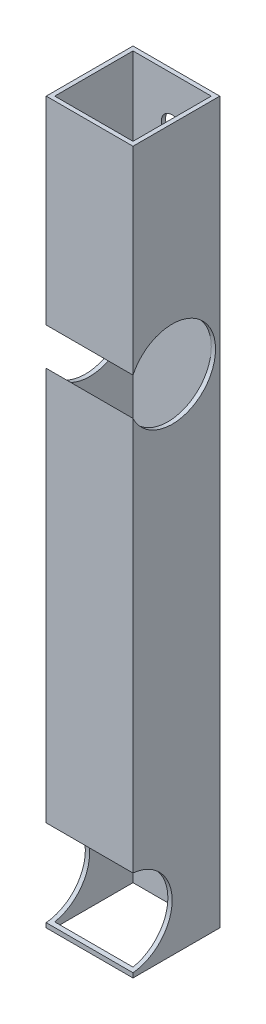
ISO-10303-21;
HEADER;
FILE_DESCRIPTION(('STEP AP214'),'2;1');
FILE_NAME('part.step','',(''),(''),'','','');
FILE_SCHEMA(('AUTOMOTIVE_DESIGN { 1 0 10303 214 1 1 1 1 }'));
ENDSEC;
DATA;
#1=APPLICATION_CONTEXT('core data for automotive mechanical design processes');
#2=APPLICATION_PROTOCOL_DEFINITION('international standard','automotive_design',2000,#1);
#3=PRODUCT_CONTEXT('',#1,'mechanical');
#4=PRODUCT('Part','Part','',(#3));
#5=PRODUCT_RELATED_PRODUCT_CATEGORY('part','',(#4));
#6=PRODUCT_DEFINITION_FORMATION('','',#4);
#7=PRODUCT_DEFINITION_CONTEXT('part definition',#1,'design');
#8=PRODUCT_DEFINITION('design','',#6,#7);
#9=PRODUCT_DEFINITION_SHAPE('','',#8);
#10=(LENGTH_UNIT() NAMED_UNIT(*) SI_UNIT(.MILLI.,.METRE.));
#11=(NAMED_UNIT(*) PLANE_ANGLE_UNIT() SI_UNIT($,.RADIAN.));
#12=(NAMED_UNIT(*) SI_UNIT($,.STERADIAN.) SOLID_ANGLE_UNIT());
#13=UNCERTAINTY_MEASURE_WITH_UNIT(LENGTH_MEASURE(1.E-05),#10,'distance_accuracy_value','');
#14=(GEOMETRIC_REPRESENTATION_CONTEXT(3) GLOBAL_UNCERTAINTY_ASSIGNED_CONTEXT((#13)) GLOBAL_UNIT_ASSIGNED_CONTEXT((#10,
#11,#12)) REPRESENTATION_CONTEXT('',''));
#15=CARTESIAN_POINT('',(0.,0.,0.));
#16=DIRECTION('',(0.,0.,1.));
#17=DIRECTION('',(1.,0.,0.));
#18=AXIS2_PLACEMENT_3D('',#15,#16,#17);
#19=CARTESIAN_POINT('',(-12.7,210.82,12.7));
#20=DIRECTION('',(0.,0.,-1.));
#21=DIRECTION('',(-1.,0.,0.));
#22=AXIS2_PLACEMENT_3D('',#19,#20,#21);
#23=PLANE('',#22);
#24=DIRECTION('',(0.,-1.,0.));
#25=VECTOR('',#24,1.);
#26=CARTESIAN_POINT('',(-12.7,210.82,12.7));
#27=LINE('',#26,#25);
#28=CARTESIAN_POINT('',(-12.7,141.836952413119,12.7));
#29=VERTEX_POINT('',#28);
#30=CARTESIAN_POINT('',(-12.7,26.6088674666681,12.7));
#31=VERTEX_POINT('',#30);
#32=EDGE_CURVE('E189',#29,#31,#27,.T.);
#33=ORIENTED_EDGE('',*,*,#32,.T.);
#34=DIRECTION('',(1.,0.,0.));
#35=VECTOR('',#34,1.);
#36=CARTESIAN_POINT('',(-198.12,26.6088674666681,12.7));
#37=LINE('',#36,#35);
#38=CARTESIAN_POINT('',(12.7,26.6088674666681,12.7));
#39=VERTEX_POINT('',#38);
#40=EDGE_CURVE('E247',#31,#39,#37,.T.);
#41=ORIENTED_EDGE('',*,*,#40,.T.);
#42=DIRECTION('',(0.,-1.,0.));
#43=VECTOR('',#42,1.);
#44=CARTESIAN_POINT('',(12.7,210.82,12.7));
#45=LINE('',#44,#43);
#46=CARTESIAN_POINT('',(12.7,141.836952413119,12.7));
#47=VERTEX_POINT('',#46);
#48=EDGE_CURVE('E186',#47,#39,#45,.T.);
#49=ORIENTED_EDGE('',*,*,#48,.F.);
#50=DIRECTION('',(1.,0.,0.));
#51=VECTOR('',#50,1.);
#52=CARTESIAN_POINT('',(-198.12,141.836952413119,12.7));
#53=LINE('',#52,#51);
#54=EDGE_CURVE('E163',#47,#29,#53,.F.);
#55=ORIENTED_EDGE('',*,*,#54,.T.);
#56=EDGE_LOOP('',(#33,#41,#49,#55));
#57=FACE_BOUND('',#56,.T.);
#58=ADVANCED_FACE('F43',(#57),#23,.F.);
#59=CARTESIAN_POINT('',(-12.7,210.82,12.7));
#60=VERTEX_POINT('',#59);
#61=CARTESIAN_POINT('',(-12.7,152.803047586881,12.7));
#62=VERTEX_POINT('',#61);
#63=EDGE_CURVE('E179',#60,#62,#27,.T.);
#64=ORIENTED_EDGE('',*,*,#63,.T.);
#65=DIRECTION('',(1.,0.,0.));
#66=VECTOR('',#65,1.);
#67=CARTESIAN_POINT('',(-198.12,152.803047586881,12.7));
#68=LINE('',#67,#66);
#69=CARTESIAN_POINT('',(12.7,152.803047586881,12.7));
#70=VERTEX_POINT('',#69);
#71=EDGE_CURVE('E162',#62,#70,#68,.T.);
#72=ORIENTED_EDGE('',*,*,#71,.T.);
#73=CARTESIAN_POINT('',(12.7,210.82,12.7));
#74=VERTEX_POINT('',#73);
#75=EDGE_CURVE('E176',#74,#70,#45,.T.);
#76=ORIENTED_EDGE('',*,*,#75,.F.);
#77=DIRECTION('',(1.,0.,0.));
#78=VECTOR('',#77,1.);
#79=CARTESIAN_POINT('',(-12.7,210.82,12.7));
#80=LINE('',#79,#78);
#81=EDGE_CURVE('E192',#60,#74,#80,.T.);
#82=ORIENTED_EDGE('',*,*,#81,.F.);
#83=EDGE_LOOP('',(#64,#72,#76,#82));
#84=FACE_BOUND('',#83,.T.);
#85=ADVANCED_FACE('F174',(#84),#23,.F.);
#86=CARTESIAN_POINT('',(11.4554,210.82,11.4554));
#87=DIRECTION('',(-1.,0.,0.));
#88=DIRECTION('',(0.,0.,1.));
#89=AXIS2_PLACEMENT_3D('',#86,#87,#88);
#90=PLANE('',#89);
#91=CARTESIAN_POINT('',(11.4554,147.32,1.2446));
#92=DIRECTION('',(-1.,0.,0.));
#93=DIRECTION('',(0.,0.,1.));
#94=AXIS2_PLACEMENT_3D('',#91,#92,#93);
#95=CIRCLE('',#94,12.7);
#96=CARTESIAN_POINT('',(11.4554,154.871792062815,11.4554));
#97=VERTEX_POINT('',#96);
#98=CARTESIAN_POINT('',(11.4554,147.32,-11.4554));
#99=VERTEX_POINT('',#98);
#100=EDGE_CURVE('E266',#97,#99,#95,.T.);
#101=ORIENTED_EDGE('',*,*,#100,.F.);
#102=DIRECTION('',(0.,-1.,0.));
#103=VECTOR('',#102,1.);
#104=CARTESIAN_POINT('',(11.4554,210.82,11.4554));
#105=LINE('',#104,#103);
#106=CARTESIAN_POINT('',(11.4554,210.82,11.4554));
#107=VERTEX_POINT('',#106);
#108=EDGE_CURVE('E229',#107,#97,#105,.T.);
#109=ORIENTED_EDGE('',*,*,#108,.F.);
#110=DIRECTION('',(0.,0.,-1.));
#111=VECTOR('',#110,1.);
#112=CARTESIAN_POINT('',(11.4554,210.82,11.4554));
#113=LINE('',#112,#111);
#114=CARTESIAN_POINT('',(11.4554,210.82,-11.4554));
#115=VERTEX_POINT('',#114);
#116=EDGE_CURVE('E237',#107,#115,#113,.T.);
#117=ORIENTED_EDGE('',*,*,#116,.T.);
#118=DIRECTION('',(0.,-1.,0.));
#119=VECTOR('',#118,1.);
#120=CARTESIAN_POINT('',(11.4554,210.82,-11.4554));
#121=LINE('',#120,#119);
#122=EDGE_CURVE('E207',#115,#99,#121,.T.);
#123=ORIENTED_EDGE('',*,*,#122,.T.);
#124=EDGE_LOOP('',(#101,#109,#117,#123));
#125=FACE_BOUND('',#124,.T.);
#126=ADVANCED_FACE('F352',(#125),#90,.T.);
#127=CARTESIAN_POINT('',(-11.4554,210.82,11.4554));
#128=DIRECTION('',(1.,0.,0.));
#129=DIRECTION('',(0.,0.,-1.));
#130=AXIS2_PLACEMENT_3D('',#127,#128,#129);
#131=PLANE('',#130);
#132=CARTESIAN_POINT('',(-11.4554,147.32,1.2446));
#133=DIRECTION('',(1.,0.,0.));
#134=DIRECTION('',(0.,0.,-1.));
#135=AXIS2_PLACEMENT_3D('',#132,#133,#134);
#136=CIRCLE('',#135,12.7);
#137=CARTESIAN_POINT('',(-11.4554,147.32,-11.4554));
#138=VERTEX_POINT('',#137);
#139=CARTESIAN_POINT('',(-11.4554,154.871792062815,11.4554));
#140=VERTEX_POINT('',#139);
#141=EDGE_CURVE('E269',#138,#140,#136,.T.);
#142=ORIENTED_EDGE('',*,*,#141,.F.);
#143=DIRECTION('',(0.,-1.,0.));
#144=VECTOR('',#143,1.);
#145=CARTESIAN_POINT('',(-11.4554,210.82,-11.4554));
#146=LINE('',#145,#144);
#147=CARTESIAN_POINT('',(-11.4554,210.82,-11.4554));
#148=VERTEX_POINT('',#147);
#149=EDGE_CURVE('E220',#148,#138,#146,.T.);
#150=ORIENTED_EDGE('',*,*,#149,.F.);
#151=DIRECTION('',(0.,0.,1.));
#152=VECTOR('',#151,1.);
#153=CARTESIAN_POINT('',(-11.4554,210.82,11.4554));
#154=LINE('',#153,#152);
#155=CARTESIAN_POINT('',(-11.4554,210.82,11.4554));
#156=VERTEX_POINT('',#155);
#157=EDGE_CURVE('E250',#148,#156,#154,.T.);
#158=ORIENTED_EDGE('',*,*,#157,.T.);
#159=DIRECTION('',(0.,-1.,0.));
#160=VECTOR('',#159,1.);
#161=CARTESIAN_POINT('',(-11.4554,210.82,11.4554));
#162=LINE('',#161,#160);
#163=EDGE_CURVE('E224',#156,#140,#162,.T.);
#164=ORIENTED_EDGE('',*,*,#163,.T.);
#165=EDGE_LOOP('',(#142,#150,#158,#164));
#166=FACE_BOUND('',#165,.T.);
#167=ADVANCED_FACE('F341',(#166),#131,.T.);
#168=CARTESIAN_POINT('',(-11.4554,210.82,11.4554));
#169=DIRECTION('',(0.,0.,-1.));
#170=DIRECTION('',(-1.,0.,0.));
#171=AXIS2_PLACEMENT_3D('',#168,#169,#170);
#172=PLANE('',#171);
#173=DIRECTION('',(1.,0.,0.));
#174=VECTOR('',#173,1.);
#175=CARTESIAN_POINT('',(-198.12,26.4236694736933,11.4554));
#176=LINE('',#175,#174);
#177=CARTESIAN_POINT('',(-11.4554,26.4236694736933,11.4554));
#178=VERTEX_POINT('',#177);
#179=CARTESIAN_POINT('',(11.4554,26.4236694736933,11.4554));
#180=VERTEX_POINT('',#179);
#181=EDGE_CURVE('E11',#178,#180,#176,.T.);
#182=ORIENTED_EDGE('',*,*,#181,.F.);
#183=CARTESIAN_POINT('',(-11.4554,139.768207937185,11.4554));
#184=VERTEX_POINT('',#183);
#185=EDGE_CURVE('E227',#184,#178,#162,.T.);
#186=ORIENTED_EDGE('',*,*,#185,.F.);
#187=DIRECTION('',(1.,0.,0.));
#188=VECTOR('',#187,1.);
#189=CARTESIAN_POINT('',(-198.12,139.768207937185,11.4554));
#190=LINE('',#189,#188);
#191=CARTESIAN_POINT('',(11.4554,139.768207937185,11.4554));
#192=VERTEX_POINT('',#191);
#193=EDGE_CURVE('E307',#192,#184,#190,.F.);
#194=ORIENTED_EDGE('',*,*,#193,.F.);
#195=EDGE_CURVE('E232',#192,#180,#105,.T.);
#196=ORIENTED_EDGE('',*,*,#195,.T.);
#197=EDGE_LOOP('',(#182,#186,#194,#196));
#198=FACE_BOUND('',#197,.T.);
#199=ADVANCED_FACE('F361',(#198),#172,.T.);
#200=DIRECTION('',(1.,0.,0.));
#201=VECTOR('',#200,1.);
#202=CARTESIAN_POINT('',(-198.12,154.871792062815,11.4554));
#203=LINE('',#202,#201);
#204=EDGE_CURVE('E309',#140,#97,#203,.T.);
#205=ORIENTED_EDGE('',*,*,#204,.F.);
#206=ORIENTED_EDGE('',*,*,#163,.F.);
#207=DIRECTION('',(1.,0.,0.));
#208=VECTOR('',#207,1.);
#209=CARTESIAN_POINT('',(-11.4554,210.82,11.4554));
#210=LINE('',#209,#208);
#211=EDGE_CURVE('E248',#156,#107,#210,.T.);
#212=ORIENTED_EDGE('',*,*,#211,.T.);
#213=ORIENTED_EDGE('',*,*,#108,.T.);
#214=EDGE_LOOP('',(#205,#206,#212,#213));
#215=FACE_BOUND('',#214,.T.);
#216=ADVANCED_FACE('F349',(#215),#172,.T.);
#217=CARTESIAN_POINT('',(0.,210.82,0.));
#218=DIRECTION('',(0.,-1.,0.));
#219=DIRECTION('',(0.,0.,-1.));
#220=AXIS2_PLACEMENT_3D('',#217,#218,#219);
#221=PLANE('',#220);
#222=DIRECTION('',(0.,0.,-1.));
#223=VECTOR('',#222,1.);
#224=CARTESIAN_POINT('',(12.7,210.82,12.7));
#225=LINE('',#224,#223);
#226=CARTESIAN_POINT('',(12.7,210.82,-12.7));
#227=VERTEX_POINT('',#226);
#228=EDGE_CURVE('E184',#74,#227,#225,.T.);
#229=ORIENTED_EDGE('',*,*,#228,.T.);
#230=DIRECTION('',(-1.,0.,0.));
#231=VECTOR('',#230,1.);
#232=CARTESIAN_POINT('',(-12.7,210.82,-12.7));
#233=LINE('',#232,#231);
#234=CARTESIAN_POINT('',(-12.7,210.82,-12.7));
#235=VERTEX_POINT('',#234);
#236=EDGE_CURVE('E200',#227,#235,#233,.T.);
#237=ORIENTED_EDGE('',*,*,#236,.T.);
#238=DIRECTION('',(0.,0.,1.));
#239=VECTOR('',#238,1.);
#240=CARTESIAN_POINT('',(-12.7,210.82,12.7));
#241=LINE('',#240,#239);
#242=EDGE_CURVE('E197',#235,#60,#241,.T.);
#243=ORIENTED_EDGE('',*,*,#242,.T.);
#244=ORIENTED_EDGE('',*,*,#81,.T.);
#245=EDGE_LOOP('',(#229,#237,#243,#244));
#246=FACE_BOUND('',#245,.T.);
#247=ORIENTED_EDGE('',*,*,#116,.F.);
#248=ORIENTED_EDGE('',*,*,#211,.F.);
#249=ORIENTED_EDGE('',*,*,#157,.F.);
#250=DIRECTION('',(-1.,0.,0.));
#251=VECTOR('',#250,1.);
#252=CARTESIAN_POINT('',(-11.4554,210.82,-11.4554));
#253=LINE('',#252,#251);
#254=EDGE_CURVE('E253',#115,#148,#253,.T.);
#255=ORIENTED_EDGE('',*,*,#254,.F.);
#256=EDGE_LOOP('',(#247,#248,#249,#255));
#257=FACE_BOUND('',#256,.T.);
#258=ADVANCED_FACE('F345',(#246,#257),#221,.F.);
#259=CARTESIAN_POINT('',(0.,0.,0.));
#260=DIRECTION('',(0.,-1.,0.));
#261=DIRECTION('',(0.,0.,-1.));
#262=AXIS2_PLACEMENT_3D('',#259,#260,#261);
#263=PLANE('',#262);
#264=DIRECTION('',(0.,0.,-1.));
#265=VECTOR('',#264,1.);
#266=CARTESIAN_POINT('',(12.7,0.,12.7));
#267=LINE('',#266,#265);
#268=CARTESIAN_POINT('',(12.7,0.,12.7));
#269=VERTEX_POINT('',#268);
#270=CARTESIAN_POINT('',(12.7,0.,-12.7));
#271=VERTEX_POINT('',#270);
#272=EDGE_CURVE('E204',#269,#271,#267,.T.);
#273=ORIENTED_EDGE('',*,*,#272,.F.);
#274=DIRECTION('',(1.,0.,0.));
#275=VECTOR('',#274,1.);
#276=CARTESIAN_POINT('',(-12.7,0.,12.7));
#277=LINE('',#276,#275);
#278=CARTESIAN_POINT('',(-12.7,0.,12.7));
#279=VERTEX_POINT('',#278);
#280=EDGE_CURVE('E211',#279,#269,#277,.T.);
#281=ORIENTED_EDGE('',*,*,#280,.F.);
#282=DIRECTION('',(0.,0.,1.));
#283=VECTOR('',#282,1.);
#284=CARTESIAN_POINT('',(-12.7,0.,12.7));
#285=LINE('',#284,#283);
#286=CARTESIAN_POINT('',(-12.7,0.,-12.7));
#287=VERTEX_POINT('',#286);
#288=EDGE_CURVE('E209',#287,#279,#285,.T.);
#289=ORIENTED_EDGE('',*,*,#288,.F.);
#290=DIRECTION('',(-1.,0.,0.));
#291=VECTOR('',#290,1.);
#292=CARTESIAN_POINT('',(-12.7,0.,-12.7));
#293=LINE('',#292,#291);
#294=EDGE_CURVE('E206',#271,#287,#293,.T.);
#295=ORIENTED_EDGE('',*,*,#294,.F.);
#296=EDGE_LOOP('',(#273,#281,#289,#295));
#297=FACE_BOUND('',#296,.T.);
#298=DIRECTION('',(1.,0.,0.));
#299=VECTOR('',#298,1.);
#300=CARTESIAN_POINT('',(-11.4554,0.,11.4554));
#301=LINE('',#300,#299);
#302=CARTESIAN_POINT('',(-11.4554,0.,11.4554));
#303=VERTEX_POINT('',#302);
#304=CARTESIAN_POINT('',(11.4554,0.,11.4554));
#305=VERTEX_POINT('',#304);
#306=EDGE_CURVE('E234',#303,#305,#301,.T.);
#307=ORIENTED_EDGE('',*,*,#306,.T.);
#308=DIRECTION('',(0.,0.,-1.));
#309=VECTOR('',#308,1.);
#310=CARTESIAN_POINT('',(11.4554,0.,11.4554));
#311=LINE('',#310,#309);
#312=CARTESIAN_POINT('',(11.4554,0.,-11.4554));
#313=VERTEX_POINT('',#312);
#314=EDGE_CURVE('E244',#305,#313,#311,.T.);
#315=ORIENTED_EDGE('',*,*,#314,.T.);
#316=DIRECTION('',(-1.,0.,0.));
#317=VECTOR('',#316,1.);
#318=CARTESIAN_POINT('',(-11.4554,0.,-11.4554));
#319=LINE('',#318,#317);
#320=CARTESIAN_POINT('',(-11.4554,0.,-11.4554));
#321=VERTEX_POINT('',#320);
#322=EDGE_CURVE('E241',#313,#321,#319,.T.);
#323=ORIENTED_EDGE('',*,*,#322,.T.);
#324=DIRECTION('',(0.,0.,1.));
#325=VECTOR('',#324,1.);
#326=CARTESIAN_POINT('',(-11.4554,0.,11.4554));
#327=LINE('',#326,#325);
#328=EDGE_CURVE('E238',#321,#303,#327,.T.);
#329=ORIENTED_EDGE('',*,*,#328,.T.);
#330=EDGE_LOOP('',(#307,#315,#323,#329));
#331=FACE_BOUND('',#330,.T.);
#332=ADVANCED_FACE('F305',(#297,#331),#263,.T.);
#333=CARTESIAN_POINT('',(12.7,210.82,12.7));
#334=DIRECTION('',(-1.,0.,0.));
#335=DIRECTION('',(0.,0.,1.));
#336=AXIS2_PLACEMENT_3D('',#333,#334,#335);
#337=PLANE('',#336);
#338=ORIENTED_EDGE('',*,*,#48,.T.);
#339=CARTESIAN_POINT('',(12.7,13.97,13.9446));
#340=DIRECTION('',(1.,0.,0.));
#341=DIRECTION('',(0.,0.,-1.));
#342=AXIS2_PLACEMENT_3D('',#339,#340,#341);
#343=CIRCLE('',#342,12.7);
#344=CARTESIAN_POINT('',(12.7,1.33113253333196,12.7));
#345=VERTEX_POINT('',#344);
#346=EDGE_CURVE('E168',#345,#39,#343,.T.);
#347=ORIENTED_EDGE('',*,*,#346,.F.);
#348=EDGE_CURVE('E188',#345,#269,#45,.T.);
#349=ORIENTED_EDGE('',*,*,#348,.T.);
#350=ORIENTED_EDGE('',*,*,#272,.T.);
#351=DIRECTION('',(0.,-1.,0.));
#352=VECTOR('',#351,1.);
#353=CARTESIAN_POINT('',(12.7,210.82,-12.7));
#354=LINE('',#353,#352);
#355=EDGE_CURVE('E299',#227,#271,#354,.T.);
#356=ORIENTED_EDGE('',*,*,#355,.F.);
#357=ORIENTED_EDGE('',*,*,#228,.F.);
#358=ORIENTED_EDGE('',*,*,#75,.T.);
#359=CARTESIAN_POINT('',(12.7,147.32,1.2446));
#360=DIRECTION('',(1.,0.,0.));
#361=DIRECTION('',(0.,0.,-1.));
#362=AXIS2_PLACEMENT_3D('',#359,#360,#361);
#363=CIRCLE('',#362,12.7);
#364=EDGE_CURVE('E159',#47,#70,#363,.T.);
#365=ORIENTED_EDGE('',*,*,#364,.F.);
#366=EDGE_LOOP('',(#338,#347,#349,#350,#356,#357,#358,#365));
#367=FACE_BOUND('',#366,.T.);
#368=ADVANCED_FACE('F45',(#367),#337,.F.);
#369=CARTESIAN_POINT('',(-12.7,210.82,-12.7));
#370=DIRECTION('',(0.,0.,1.));
#371=DIRECTION('',(1.,0.,0.));
#372=AXIS2_PLACEMENT_3D('',#369,#370,#371);
#373=PLANE('',#372);
#374=CARTESIAN_POINT('',(0.,197.1675,-12.7));
#375=DIRECTION('',(0.,0.,-1.));
#376=DIRECTION('',(-1.,0.,0.));
#377=AXIS2_PLACEMENT_3D('',#374,#375,#376);
#378=CIRCLE('',#377,3.175);
#379=CARTESIAN_POINT('',(-3.175,197.1675,-12.7));
#380=VERTEX_POINT('',#379);
#381=EDGE_CURVE('E276',#380,#380,#378,.T.);
#382=ORIENTED_EDGE('',*,*,#381,.F.);
#383=EDGE_LOOP('',(#382));
#384=FACE_BOUND('',#383,.T.);
#385=CARTESIAN_POINT('',(0.,14.2875,-12.7));
#386=DIRECTION('',(0.,0.,-1.));
#387=DIRECTION('',(-1.,0.,0.));
#388=AXIS2_PLACEMENT_3D('',#385,#386,#387);
#389=CIRCLE('',#388,3.175);
#390=CARTESIAN_POINT('',(-3.175,14.2875,-12.7));
#391=VERTEX_POINT('',#390);
#392=EDGE_CURVE('E273',#391,#391,#389,.T.);
#393=ORIENTED_EDGE('',*,*,#392,.F.);
#394=EDGE_LOOP('',(#393));
#395=FACE_BOUND('',#394,.T.);
#396=ORIENTED_EDGE('',*,*,#294,.T.);
#397=DIRECTION('',(0.,-1.,0.));
#398=VECTOR('',#397,1.);
#399=CARTESIAN_POINT('',(-12.7,210.82,-12.7));
#400=LINE('',#399,#398);
#401=EDGE_CURVE('E297',#235,#287,#400,.T.);
#402=ORIENTED_EDGE('',*,*,#401,.F.);
#403=ORIENTED_EDGE('',*,*,#236,.F.);
#404=ORIENTED_EDGE('',*,*,#355,.T.);
#405=EDGE_LOOP('',(#396,#402,#403,#404));
#406=FACE_BOUND('',#405,.T.);
#407=ADVANCED_FACE('F288',(#384,#395,#406),#373,.F.);
#408=CARTESIAN_POINT('',(-12.7,210.82,12.7));
#409=DIRECTION('',(1.,0.,0.));
#410=DIRECTION('',(0.,0.,-1.));
#411=AXIS2_PLACEMENT_3D('',#408,#409,#410);
#412=PLANE('',#411);
#413=CARTESIAN_POINT('',(-12.7,1.33113253333197,12.7));
#414=VERTEX_POINT('',#413);
#415=EDGE_CURVE('E185',#414,#279,#27,.T.);
#416=ORIENTED_EDGE('',*,*,#415,.F.);
#417=CARTESIAN_POINT('',(-12.7,13.97,13.9446));
#418=DIRECTION('',(1.,0.,0.));
#419=DIRECTION('',(0.,0.,-1.));
#420=AXIS2_PLACEMENT_3D('',#417,#418,#419);
#421=CIRCLE('',#420,12.7);
#422=EDGE_CURVE('E58',#414,#31,#421,.T.);
#423=ORIENTED_EDGE('',*,*,#422,.T.);
#424=ORIENTED_EDGE('',*,*,#32,.F.);
#425=CARTESIAN_POINT('',(-12.7,147.32,1.2446));
#426=DIRECTION('',(1.,0.,0.));
#427=DIRECTION('',(0.,0.,-1.));
#428=AXIS2_PLACEMENT_3D('',#425,#426,#427);
#429=CIRCLE('',#428,12.7);
#430=EDGE_CURVE('E66',#29,#62,#429,.T.);
#431=ORIENTED_EDGE('',*,*,#430,.T.);
#432=ORIENTED_EDGE('',*,*,#63,.F.);
#433=ORIENTED_EDGE('',*,*,#242,.F.);
#434=ORIENTED_EDGE('',*,*,#401,.T.);
#435=ORIENTED_EDGE('',*,*,#288,.T.);
#436=EDGE_LOOP('',(#416,#423,#424,#431,#432,#433,#434,#435));
#437=FACE_BOUND('',#436,.T.);
#438=ADVANCED_FACE('F291',(#437),#412,.F.);
#439=ORIENTED_EDGE('',*,*,#348,.F.);
#440=DIRECTION('',(1.,0.,0.));
#441=VECTOR('',#440,1.);
#442=CARTESIAN_POINT('',(-198.12,1.33113253333196,12.7));
#443=LINE('',#442,#441);
#444=EDGE_CURVE('E259',#345,#414,#443,.F.);
#445=ORIENTED_EDGE('',*,*,#444,.T.);
#446=ORIENTED_EDGE('',*,*,#415,.T.);
#447=ORIENTED_EDGE('',*,*,#280,.T.);
#448=EDGE_LOOP('',(#439,#445,#446,#447));
#449=FACE_BOUND('',#448,.T.);
#450=ADVANCED_FACE('F374',(#449),#23,.F.);
#451=CARTESIAN_POINT('',(11.4554,13.97,13.9446));
#452=DIRECTION('',(-1.,0.,0.));
#453=DIRECTION('',(0.,0.,1.));
#454=AXIS2_PLACEMENT_3D('',#451,#452,#453);
#455=CIRCLE('',#454,12.7);
#456=CARTESIAN_POINT('',(11.4554,1.51633052630673,11.4554));
#457=VERTEX_POINT('',#456);
#458=EDGE_CURVE('E261',#180,#457,#455,.T.);
#459=ORIENTED_EDGE('',*,*,#458,.F.);
#460=ORIENTED_EDGE('',*,*,#195,.F.);
#461=EDGE_CURVE('E267',#99,#192,#95,.T.);
#462=ORIENTED_EDGE('',*,*,#461,.F.);
#463=EDGE_CURVE('E219',#99,#313,#121,.T.);
#464=ORIENTED_EDGE('',*,*,#463,.T.);
#465=ORIENTED_EDGE('',*,*,#314,.F.);
#466=EDGE_CURVE('E233',#457,#305,#105,.T.);
#467=ORIENTED_EDGE('',*,*,#466,.F.);
#468=EDGE_LOOP('',(#459,#460,#462,#464,#465,#467));
#469=FACE_BOUND('',#468,.T.);
#470=ADVANCED_FACE('F358',(#469),#90,.T.);
#471=CARTESIAN_POINT('',(-11.4554,210.82,-11.4554));
#472=DIRECTION('',(0.,0.,1.));
#473=DIRECTION('',(1.,0.,0.));
#474=AXIS2_PLACEMENT_3D('',#471,#472,#473);
#475=PLANE('',#474);
#476=CARTESIAN_POINT('',(0.,197.1675,-11.4554));
#477=DIRECTION('',(0.,0.,1.));
#478=DIRECTION('',(1.,0.,0.));
#479=AXIS2_PLACEMENT_3D('',#476,#477,#478);
#480=CIRCLE('',#479,3.175);
#481=CARTESIAN_POINT('',(3.175,197.1675,-11.4554));
#482=VERTEX_POINT('',#481);
#483=EDGE_CURVE('E169',#482,#482,#480,.F.);
#484=ORIENTED_EDGE('',*,*,#483,.T.);
#485=EDGE_LOOP('',(#484));
#486=FACE_BOUND('',#485,.T.);
#487=CARTESIAN_POINT('',(0.,14.2875,-11.4554));
#488=DIRECTION('',(0.,0.,1.));
#489=DIRECTION('',(1.,0.,0.));
#490=AXIS2_PLACEMENT_3D('',#487,#488,#489);
#491=CIRCLE('',#490,3.175);
#492=CARTESIAN_POINT('',(3.175,14.2875,-11.4554));
#493=VERTEX_POINT('',#492);
#494=EDGE_CURVE('E277',#493,#493,#491,.F.);
#495=ORIENTED_EDGE('',*,*,#494,.T.);
#496=EDGE_LOOP('',(#495));
#497=FACE_BOUND('',#496,.T.);
#498=ORIENTED_EDGE('',*,*,#463,.F.);
#499=ORIENTED_EDGE('',*,*,#122,.F.);
#500=ORIENTED_EDGE('',*,*,#254,.T.);
#501=ORIENTED_EDGE('',*,*,#149,.T.);
#502=EDGE_CURVE('E223',#138,#321,#146,.T.);
#503=ORIENTED_EDGE('',*,*,#502,.T.);
#504=ORIENTED_EDGE('',*,*,#322,.F.);
#505=EDGE_LOOP('',(#498,#499,#500,#501,#503,#504));
#506=FACE_BOUND('',#505,.T.);
#507=ADVANCED_FACE('F335',(#486,#497,#506),#475,.T.);
#508=CARTESIAN_POINT('',(-11.4554,13.97,13.9446));
#509=DIRECTION('',(1.,0.,0.));
#510=DIRECTION('',(0.,0.,-1.));
#511=AXIS2_PLACEMENT_3D('',#508,#509,#510);
#512=CIRCLE('',#511,12.7);
#513=CARTESIAN_POINT('',(-11.4554,1.51633052630673,11.4554));
#514=VERTEX_POINT('',#513);
#515=EDGE_CURVE('E180',#514,#178,#512,.T.);
#516=ORIENTED_EDGE('',*,*,#515,.F.);
#517=EDGE_CURVE('E228',#514,#303,#162,.T.);
#518=ORIENTED_EDGE('',*,*,#517,.T.);
#519=ORIENTED_EDGE('',*,*,#328,.F.);
#520=ORIENTED_EDGE('',*,*,#502,.F.);
#521=EDGE_CURVE('E270',#184,#138,#136,.T.);
#522=ORIENTED_EDGE('',*,*,#521,.F.);
#523=ORIENTED_EDGE('',*,*,#185,.T.);
#524=EDGE_LOOP('',(#516,#518,#519,#520,#522,#523));
#525=FACE_BOUND('',#524,.T.);
#526=ADVANCED_FACE('F323',(#525),#131,.T.);
#527=DIRECTION('',(1.,0.,0.));
#528=VECTOR('',#527,1.);
#529=CARTESIAN_POINT('',(-198.12,1.51633052630673,11.4554));
#530=LINE('',#529,#528);
#531=EDGE_CURVE('E51',#457,#514,#530,.F.);
#532=ORIENTED_EDGE('',*,*,#531,.F.);
#533=ORIENTED_EDGE('',*,*,#466,.T.);
#534=ORIENTED_EDGE('',*,*,#306,.F.);
#535=ORIENTED_EDGE('',*,*,#517,.F.);
#536=EDGE_LOOP('',(#532,#533,#534,#535));
#537=FACE_BOUND('',#536,.T.);
#538=ADVANCED_FACE('F328',(#537),#172,.T.);
#539=CARTESIAN_POINT('',(-198.12,147.32,1.2446));
#540=DIRECTION('',(1.,0.,0.));
#541=DIRECTION('',(0.,0.,-1.));
#542=AXIS2_PLACEMENT_3D('',#539,#540,#541);
#543=CYLINDRICAL_SURFACE('',#542,12.7);
#544=ORIENTED_EDGE('',*,*,#204,.T.);
#545=ORIENTED_EDGE('',*,*,#100,.T.);
#546=ORIENTED_EDGE('',*,*,#461,.T.);
#547=ORIENTED_EDGE('',*,*,#193,.T.);
#548=ORIENTED_EDGE('',*,*,#521,.T.);
#549=ORIENTED_EDGE('',*,*,#141,.T.);
#550=EDGE_LOOP('',(#544,#545,#546,#547,#548,#549));
#551=FACE_BOUND('',#550,.T.);
#552=ORIENTED_EDGE('',*,*,#430,.F.);
#553=ORIENTED_EDGE('',*,*,#54,.F.);
#554=ORIENTED_EDGE('',*,*,#364,.T.);
#555=ORIENTED_EDGE('',*,*,#71,.F.);
#556=EDGE_LOOP('',(#552,#553,#554,#555));
#557=FACE_BOUND('',#556,.T.);
#558=ADVANCED_FACE('F161',(#551,#557),#543,.F.);
#559=CARTESIAN_POINT('',(-198.12,13.97,13.9446));
#560=DIRECTION('',(1.,0.,0.));
#561=DIRECTION('',(0.,0.,-1.));
#562=AXIS2_PLACEMENT_3D('',#559,#560,#561);
#563=CYLINDRICAL_SURFACE('',#562,12.7);
#564=ORIENTED_EDGE('',*,*,#181,.T.);
#565=ORIENTED_EDGE('',*,*,#458,.T.);
#566=ORIENTED_EDGE('',*,*,#531,.T.);
#567=ORIENTED_EDGE('',*,*,#515,.T.);
#568=EDGE_LOOP('',(#564,#565,#566,#567));
#569=FACE_BOUND('',#568,.T.);
#570=ORIENTED_EDGE('',*,*,#422,.F.);
#571=ORIENTED_EDGE('',*,*,#444,.F.);
#572=ORIENTED_EDGE('',*,*,#346,.T.);
#573=ORIENTED_EDGE('',*,*,#40,.F.);
#574=EDGE_LOOP('',(#570,#571,#572,#573));
#575=FACE_BOUND('',#574,.T.);
#576=ADVANCED_FACE('F315',(#569,#575),#563,.F.);
#577=CARTESIAN_POINT('',(0.,14.2875,-2.47514387893083));
#578=DIRECTION('',(0.,0.,-1.));
#579=DIRECTION('',(-1.,0.,0.));
#580=AXIS2_PLACEMENT_3D('',#577,#578,#579);
#581=CYLINDRICAL_SURFACE('',#580,3.175);
#582=ORIENTED_EDGE('',*,*,#392,.T.);
#583=EDGE_LOOP('',(#582));
#584=FACE_BOUND('',#583,.T.);
#585=ORIENTED_EDGE('',*,*,#494,.F.);
#586=EDGE_LOOP('',(#585));
#587=FACE_BOUND('',#586,.T.);
#588=ADVANCED_FACE('F390',(#584,#587),#581,.F.);
#589=CARTESIAN_POINT('',(0.,197.1675,-2.47514387893083));
#590=DIRECTION('',(0.,0.,-1.));
#591=DIRECTION('',(-1.,0.,0.));
#592=AXIS2_PLACEMENT_3D('',#589,#590,#591);
#593=CYLINDRICAL_SURFACE('',#592,3.175);
#594=ORIENTED_EDGE('',*,*,#381,.T.);
#595=EDGE_LOOP('',(#594));
#596=FACE_BOUND('',#595,.T.);
#597=ORIENTED_EDGE('',*,*,#483,.F.);
#598=EDGE_LOOP('',(#597));
#599=FACE_BOUND('',#598,.T.);
#600=ADVANCED_FACE('F285',(#596,#599),#593,.F.);
#601=CLOSED_SHELL('',(#58,#85,#126,#167,#199,#216,#258,#332,#368,#407,#438,#450,#470,#507,#526,
#538,#558,#576,#588,#600));
#602=MANIFOLD_SOLID_BREP('B2',#601);
#603=ADVANCED_BREP_SHAPE_REPRESENTATION('',(#18,#602),#14);
#604=SHAPE_DEFINITION_REPRESENTATION(#9,#603);
ENDSEC;
END-ISO-10303-21;
